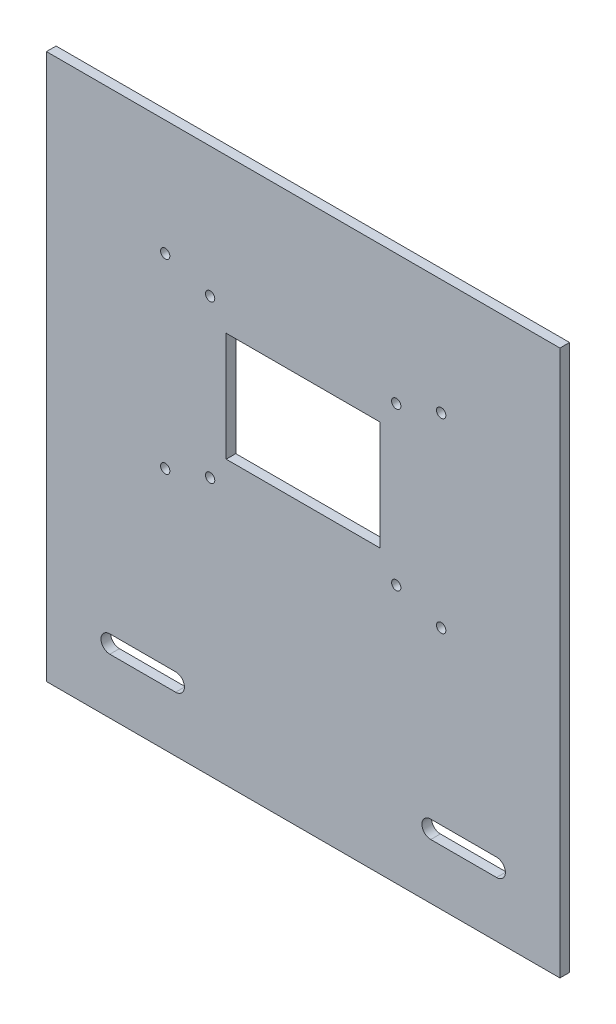
ISO-10303-21;
HEADER;
FILE_DESCRIPTION(('STEP AP214'),'2;1');
FILE_NAME('part.step','',(''),(''),'','','');
FILE_SCHEMA(('AUTOMOTIVE_DESIGN { 1 0 10303 214 1 1 1 1 }'));
ENDSEC;
DATA;
#1=APPLICATION_CONTEXT('core data for automotive mechanical design processes');
#2=APPLICATION_PROTOCOL_DEFINITION('international standard','automotive_design',2000,#1);
#3=PRODUCT_CONTEXT('',#1,'mechanical');
#4=PRODUCT('Part','Part','',(#3));
#5=PRODUCT_RELATED_PRODUCT_CATEGORY('part','',(#4));
#6=PRODUCT_DEFINITION_FORMATION('','',#4);
#7=PRODUCT_DEFINITION_CONTEXT('part definition',#1,'design');
#8=PRODUCT_DEFINITION('design','',#6,#7);
#9=PRODUCT_DEFINITION_SHAPE('','',#8);
#10=(LENGTH_UNIT() NAMED_UNIT(*) SI_UNIT(.MILLI.,.METRE.));
#11=(NAMED_UNIT(*) PLANE_ANGLE_UNIT() SI_UNIT($,.RADIAN.));
#12=(NAMED_UNIT(*) SI_UNIT($,.STERADIAN.) SOLID_ANGLE_UNIT());
#13=UNCERTAINTY_MEASURE_WITH_UNIT(LENGTH_MEASURE(1.E-05),#10,'distance_accuracy_value','');
#14=(GEOMETRIC_REPRESENTATION_CONTEXT(3) GLOBAL_UNCERTAINTY_ASSIGNED_CONTEXT((#13)) GLOBAL_UNIT_ASSIGNED_CONTEXT((#10,
#11,#12)) REPRESENTATION_CONTEXT('',''));
#15=CARTESIAN_POINT('',(0.,0.,0.));
#16=DIRECTION('',(0.,0.,1.));
#17=DIRECTION('',(1.,0.,0.));
#18=AXIS2_PLACEMENT_3D('',#15,#16,#17);
#19=CARTESIAN_POINT('',(0.,0.,3.));
#20=DIRECTION('',(0.,0.,1.));
#21=DIRECTION('',(1.,0.,0.));
#22=AXIS2_PLACEMENT_3D('',#19,#20,#21);
#23=PLANE('',#22);
#24=CARTESIAN_POINT('',(123.,76.,3.));
#25=DIRECTION('',(0.,0.,1.));
#26=DIRECTION('',(1.,0.,0.));
#27=AXIS2_PLACEMENT_3D('',#24,#25,#26);
#28=CIRCLE('',#27,1.45000000000001);
#29=CARTESIAN_POINT('',(124.45,76.,3.));
#30=VERTEX_POINT('',#29);
#31=EDGE_CURVE('E225',#30,#30,#28,.T.);
#32=ORIENTED_EDGE('',*,*,#31,.F.);
#33=EDGE_LOOP('',(#32));
#34=FACE_BOUND('',#33,.T.);
#35=CARTESIAN_POINT('',(37.,76.,3.));
#36=DIRECTION('',(0.,0.,1.));
#37=DIRECTION('',(1.,0.,0.));
#38=AXIS2_PLACEMENT_3D('',#35,#36,#37);
#39=CIRCLE('',#38,1.45);
#40=CARTESIAN_POINT('',(38.45,76.,3.));
#41=VERTEX_POINT('',#40);
#42=EDGE_CURVE('E237',#41,#41,#39,.T.);
#43=ORIENTED_EDGE('',*,*,#42,.F.);
#44=EDGE_LOOP('',(#43));
#45=FACE_BOUND('',#44,.T.);
#46=CARTESIAN_POINT('',(109.,80.5,3.));
#47=DIRECTION('',(0.,0.,1.));
#48=DIRECTION('',(1.,0.,0.));
#49=AXIS2_PLACEMENT_3D('',#46,#47,#48);
#50=CIRCLE('',#49,1.44999999999999);
#51=CARTESIAN_POINT('',(110.45,80.5,3.));
#52=VERTEX_POINT('',#51);
#53=EDGE_CURVE('E249',#52,#52,#50,.T.);
#54=ORIENTED_EDGE('',*,*,#53,.F.);
#55=EDGE_LOOP('',(#54));
#56=FACE_BOUND('',#55,.T.);
#57=CARTESIAN_POINT('',(51.,80.5,3.));
#58=DIRECTION('',(0.,0.,1.));
#59=DIRECTION('',(1.,0.,0.));
#60=AXIS2_PLACEMENT_3D('',#57,#58,#59);
#61=CIRCLE('',#60,1.45);
#62=CARTESIAN_POINT('',(52.45,80.5,3.));
#63=VERTEX_POINT('',#62);
#64=EDGE_CURVE('E261',#63,#63,#61,.T.);
#65=ORIENTED_EDGE('',*,*,#64,.F.);
#66=EDGE_LOOP('',(#65));
#67=FACE_BOUND('',#66,.T.);
#68=DIRECTION('',(0.,-1.,0.));
#69=VECTOR('',#68,1.);
#70=CARTESIAN_POINT('',(0.,170.,3.));
#71=LINE('',#70,#69);
#72=CARTESIAN_POINT('',(0.,170.,3.));
#73=VERTEX_POINT('',#72);
#74=CARTESIAN_POINT('',(0.,0.,3.));
#75=VERTEX_POINT('',#74);
#76=EDGE_CURVE('E298',#73,#75,#71,.T.);
#77=ORIENTED_EDGE('',*,*,#76,.T.);
#78=DIRECTION('',(1.,0.,0.));
#79=VECTOR('',#78,1.);
#80=CARTESIAN_POINT('',(0.,0.,3.));
#81=LINE('',#80,#79);
#82=CARTESIAN_POINT('',(160.,0.,3.));
#83=VERTEX_POINT('',#82);
#84=EDGE_CURVE('E301',#75,#83,#81,.T.);
#85=ORIENTED_EDGE('',*,*,#84,.T.);
#86=DIRECTION('',(0.,1.,0.));
#87=VECTOR('',#86,1.);
#88=CARTESIAN_POINT('',(160.,0.,3.));
#89=LINE('',#88,#87);
#90=CARTESIAN_POINT('',(160.,170.,3.));
#91=VERTEX_POINT('',#90);
#92=EDGE_CURVE('E304',#83,#91,#89,.T.);
#93=ORIENTED_EDGE('',*,*,#92,.T.);
#94=DIRECTION('',(-1.,0.,0.));
#95=VECTOR('',#94,1.);
#96=CARTESIAN_POINT('',(160.,170.,3.));
#97=LINE('',#96,#95);
#98=EDGE_CURVE('E306',#91,#73,#97,.T.);
#99=ORIENTED_EDGE('',*,*,#98,.T.);
#100=EDGE_LOOP('',(#77,#85,#93,#99));
#101=FACE_BOUND('',#100,.T.);
#102=DIRECTION('',(1.,0.,0.));
#103=VECTOR('',#102,1.);
#104=CARTESIAN_POINT('',(56.,88.,3.));
#105=LINE('',#104,#103);
#106=CARTESIAN_POINT('',(56.,88.,3.));
#107=VERTEX_POINT('',#106);
#108=CARTESIAN_POINT('',(104.,88.,3.));
#109=VERTEX_POINT('',#108);
#110=EDGE_CURVE('E269',#107,#109,#105,.T.);
#111=ORIENTED_EDGE('',*,*,#110,.F.);
#112=DIRECTION('',(0.,-1.,0.));
#113=VECTOR('',#112,1.);
#114=CARTESIAN_POINT('',(56.,122.,3.));
#115=LINE('',#114,#113);
#116=CARTESIAN_POINT('',(56.,122.,3.));
#117=VERTEX_POINT('',#116);
#118=EDGE_CURVE('E267',#117,#107,#115,.T.);
#119=ORIENTED_EDGE('',*,*,#118,.F.);
#120=DIRECTION('',(-1.,0.,0.));
#121=VECTOR('',#120,1.);
#122=CARTESIAN_POINT('',(104.,122.,3.));
#123=LINE('',#122,#121);
#124=CARTESIAN_POINT('',(104.,122.,3.));
#125=VERTEX_POINT('',#124);
#126=EDGE_CURVE('E275',#125,#117,#123,.T.);
#127=ORIENTED_EDGE('',*,*,#126,.F.);
#128=DIRECTION('',(0.,1.,0.));
#129=VECTOR('',#128,1.);
#130=CARTESIAN_POINT('',(104.,88.,3.));
#131=LINE('',#130,#129);
#132=EDGE_CURVE('E272',#109,#125,#131,.T.);
#133=ORIENTED_EDGE('',*,*,#132,.F.);
#134=EDGE_LOOP('',(#111,#119,#127,#133));
#135=FACE_BOUND('',#134,.T.);
#136=CARTESIAN_POINT('',(51.,129.5,3.));
#137=DIRECTION('',(0.,0.,1.));
#138=DIRECTION('',(1.,0.,0.));
#139=AXIS2_PLACEMENT_3D('',#136,#137,#138);
#140=CIRCLE('',#139,1.45);
#141=CARTESIAN_POINT('',(52.45,129.5,3.));
#142=VERTEX_POINT('',#141);
#143=EDGE_CURVE('E255',#142,#142,#140,.T.);
#144=ORIENTED_EDGE('',*,*,#143,.F.);
#145=EDGE_LOOP('',(#144));
#146=FACE_BOUND('',#145,.T.);
#147=CARTESIAN_POINT('',(109.,129.5,3.));
#148=DIRECTION('',(0.,0.,1.));
#149=DIRECTION('',(1.,0.,0.));
#150=AXIS2_PLACEMENT_3D('',#147,#148,#149);
#151=CIRCLE('',#150,1.44999999999999);
#152=CARTESIAN_POINT('',(110.45,129.5,3.));
#153=VERTEX_POINT('',#152);
#154=EDGE_CURVE('E243',#153,#153,#151,.T.);
#155=ORIENTED_EDGE('',*,*,#154,.F.);
#156=EDGE_LOOP('',(#155));
#157=FACE_BOUND('',#156,.T.);
#158=CARTESIAN_POINT('',(37.,134.,3.));
#159=DIRECTION('',(0.,0.,1.));
#160=DIRECTION('',(1.,0.,0.));
#161=AXIS2_PLACEMENT_3D('',#158,#159,#160);
#162=CIRCLE('',#161,1.45);
#163=CARTESIAN_POINT('',(38.45,134.,3.));
#164=VERTEX_POINT('',#163);
#165=EDGE_CURVE('E231',#164,#164,#162,.T.);
#166=ORIENTED_EDGE('',*,*,#165,.F.);
#167=EDGE_LOOP('',(#166));
#168=FACE_BOUND('',#167,.T.);
#169=CARTESIAN_POINT('',(123.,134.,3.));
#170=DIRECTION('',(0.,0.,1.));
#171=DIRECTION('',(1.,0.,0.));
#172=AXIS2_PLACEMENT_3D('',#169,#170,#171);
#173=CIRCLE('',#172,1.45000000000001);
#174=CARTESIAN_POINT('',(124.45,134.,3.));
#175=VERTEX_POINT('',#174);
#176=EDGE_CURVE('E219',#175,#175,#173,.T.);
#177=ORIENTED_EDGE('',*,*,#176,.F.);
#178=EDGE_LOOP('',(#177));
#179=FACE_BOUND('',#178,.T.);
#180=DIRECTION('',(1.,0.,0.));
#181=VECTOR('',#180,1.);
#182=CARTESIAN_POINT('',(40.25,17.25,3.));
#183=LINE('',#182,#181);
#184=CARTESIAN_POINT('',(19.75,17.25,3.));
#185=VERTEX_POINT('',#184);
#186=CARTESIAN_POINT('',(40.25,17.25,3.));
#187=VERTEX_POINT('',#186);
#188=EDGE_CURVE('E190',#185,#187,#183,.T.);
#189=ORIENTED_EDGE('',*,*,#188,.F.);
#190=CARTESIAN_POINT('',(19.75,20.,3.));
#191=DIRECTION('',(0.,0.,1.));
#192=DIRECTION('',(-1.,0.,0.));
#193=AXIS2_PLACEMENT_3D('',#190,#191,#192);
#194=CIRCLE('',#193,2.75);
#195=CARTESIAN_POINT('',(19.75,22.75,3.));
#196=VERTEX_POINT('',#195);
#197=EDGE_CURVE('E188',#196,#185,#194,.T.);
#198=ORIENTED_EDGE('',*,*,#197,.F.);
#199=DIRECTION('',(-1.,0.,0.));
#200=VECTOR('',#199,1.);
#201=CARTESIAN_POINT('',(19.75,22.75,3.));
#202=LINE('',#201,#200);
#203=CARTESIAN_POINT('',(40.25,22.75,3.));
#204=VERTEX_POINT('',#203);
#205=EDGE_CURVE('E196',#204,#196,#202,.T.);
#206=ORIENTED_EDGE('',*,*,#205,.F.);
#207=CARTESIAN_POINT('',(40.25,20.,3.));
#208=DIRECTION('',(0.,0.,1.));
#209=DIRECTION('',(-1.,0.,0.));
#210=AXIS2_PLACEMENT_3D('',#207,#208,#209);
#211=CIRCLE('',#210,2.75);
#212=EDGE_CURVE('E193',#187,#204,#211,.T.);
#213=ORIENTED_EDGE('',*,*,#212,.F.);
#214=EDGE_LOOP('',(#189,#198,#206,#213));
#215=FACE_BOUND('',#214,.T.);
#216=DIRECTION('',(1.,0.,0.));
#217=VECTOR('',#216,1.);
#218=CARTESIAN_POINT('',(140.25,17.25,3.));
#219=LINE('',#218,#217);
#220=CARTESIAN_POINT('',(119.75,17.25,3.));
#221=VERTEX_POINT('',#220);
#222=CARTESIAN_POINT('',(140.25,17.25,3.));
#223=VERTEX_POINT('',#222);
#224=EDGE_CURVE('E160',#221,#223,#219,.T.);
#225=ORIENTED_EDGE('',*,*,#224,.F.);
#226=CARTESIAN_POINT('',(119.75,20.,3.));
#227=DIRECTION('',(0.,0.,1.));
#228=DIRECTION('',(-1.,0.,0.));
#229=AXIS2_PLACEMENT_3D('',#226,#227,#228);
#230=CIRCLE('',#229,2.75);
#231=CARTESIAN_POINT('',(119.75,22.75,3.));
#232=VERTEX_POINT('',#231);
#233=EDGE_CURVE('E152',#232,#221,#230,.T.);
#234=ORIENTED_EDGE('',*,*,#233,.F.);
#235=DIRECTION('',(-1.,0.,0.));
#236=VECTOR('',#235,1.);
#237=CARTESIAN_POINT('',(119.75,22.75,3.));
#238=LINE('',#237,#236);
#239=CARTESIAN_POINT('',(140.25,22.75,3.));
#240=VERTEX_POINT('',#239);
#241=EDGE_CURVE('E174',#240,#232,#238,.T.);
#242=ORIENTED_EDGE('',*,*,#241,.F.);
#243=CARTESIAN_POINT('',(140.25,20.,3.));
#244=DIRECTION('',(0.,0.,1.));
#245=DIRECTION('',(-1.,0.,0.));
#246=AXIS2_PLACEMENT_3D('',#243,#244,#245);
#247=CIRCLE('',#246,2.75);
#248=EDGE_CURVE('E172',#223,#240,#247,.T.);
#249=ORIENTED_EDGE('',*,*,#248,.F.);
#250=EDGE_LOOP('',(#225,#234,#242,#249));
#251=FACE_BOUND('',#250,.T.);
#252=ADVANCED_FACE('F39',(#34,#45,#56,#67,#101,#135,#146,#157,#168,#179,#215,#251),#23,.T.);
#253=CARTESIAN_POINT('',(0.,0.,0.));
#254=DIRECTION('',(0.,0.,1.));
#255=DIRECTION('',(1.,0.,0.));
#256=AXIS2_PLACEMENT_3D('',#253,#254,#255);
#257=PLANE('',#256);
#258=CARTESIAN_POINT('',(19.75,20.,0.));
#259=DIRECTION('',(0.,0.,1.));
#260=DIRECTION('',(-1.,0.,0.));
#261=AXIS2_PLACEMENT_3D('',#258,#259,#260);
#262=CIRCLE('',#261,2.75);
#263=CARTESIAN_POINT('',(19.75,22.75,0.));
#264=VERTEX_POINT('',#263);
#265=CARTESIAN_POINT('',(19.75,17.25,0.));
#266=VERTEX_POINT('',#265);
#267=EDGE_CURVE('E168',#264,#266,#262,.T.);
#268=ORIENTED_EDGE('',*,*,#267,.T.);
#269=DIRECTION('',(1.,0.,0.));
#270=VECTOR('',#269,1.);
#271=CARTESIAN_POINT('',(40.25,17.25,0.));
#272=LINE('',#271,#270);
#273=CARTESIAN_POINT('',(40.25,17.25,0.));
#274=VERTEX_POINT('',#273);
#275=EDGE_CURVE('E201',#266,#274,#272,.T.);
#276=ORIENTED_EDGE('',*,*,#275,.T.);
#277=CARTESIAN_POINT('',(40.25,20.,0.));
#278=DIRECTION('',(0.,0.,1.));
#279=DIRECTION('',(-1.,0.,0.));
#280=AXIS2_PLACEMENT_3D('',#277,#278,#279);
#281=CIRCLE('',#280,2.75);
#282=CARTESIAN_POINT('',(40.25,22.75,0.));
#283=VERTEX_POINT('',#282);
#284=EDGE_CURVE('E204',#274,#283,#281,.T.);
#285=ORIENTED_EDGE('',*,*,#284,.T.);
#286=DIRECTION('',(-1.,0.,0.));
#287=VECTOR('',#286,1.);
#288=CARTESIAN_POINT('',(19.75,22.75,0.));
#289=LINE('',#288,#287);
#290=EDGE_CURVE('E191',#283,#264,#289,.T.);
#291=ORIENTED_EDGE('',*,*,#290,.T.);
#292=EDGE_LOOP('',(#268,#276,#285,#291));
#293=FACE_BOUND('',#292,.T.);
#294=DIRECTION('',(0.,-1.,0.));
#295=VECTOR('',#294,1.);
#296=CARTESIAN_POINT('',(0.,170.,0.));
#297=LINE('',#296,#295);
#298=CARTESIAN_POINT('',(0.,170.,0.));
#299=VERTEX_POINT('',#298);
#300=CARTESIAN_POINT('',(0.,0.,0.));
#301=VERTEX_POINT('',#300);
#302=EDGE_CURVE('E297',#299,#301,#297,.T.);
#303=ORIENTED_EDGE('',*,*,#302,.F.);
#304=DIRECTION('',(-1.,0.,0.));
#305=VECTOR('',#304,1.);
#306=CARTESIAN_POINT('',(160.,170.,0.));
#307=LINE('',#306,#305);
#308=CARTESIAN_POINT('',(160.,170.,0.));
#309=VERTEX_POINT('',#308);
#310=EDGE_CURVE('E302',#309,#299,#307,.T.);
#311=ORIENTED_EDGE('',*,*,#310,.F.);
#312=DIRECTION('',(0.,1.,0.));
#313=VECTOR('',#312,1.);
#314=CARTESIAN_POINT('',(160.,0.,0.));
#315=LINE('',#314,#313);
#316=CARTESIAN_POINT('',(160.,0.,0.));
#317=VERTEX_POINT('',#316);
#318=EDGE_CURVE('E313',#317,#309,#315,.T.);
#319=ORIENTED_EDGE('',*,*,#318,.F.);
#320=DIRECTION('',(1.,0.,0.));
#321=VECTOR('',#320,1.);
#322=CARTESIAN_POINT('',(0.,0.,0.));
#323=LINE('',#322,#321);
#324=EDGE_CURVE('E311',#301,#317,#323,.T.);
#325=ORIENTED_EDGE('',*,*,#324,.F.);
#326=EDGE_LOOP('',(#303,#311,#319,#325));
#327=FACE_BOUND('',#326,.T.);
#328=DIRECTION('',(0.,-1.,0.));
#329=VECTOR('',#328,1.);
#330=CARTESIAN_POINT('',(56.,122.,0.));
#331=LINE('',#330,#329);
#332=CARTESIAN_POINT('',(56.,122.,0.));
#333=VERTEX_POINT('',#332);
#334=CARTESIAN_POINT('',(56.,88.,0.));
#335=VERTEX_POINT('',#334);
#336=EDGE_CURVE('E264',#333,#335,#331,.T.);
#337=ORIENTED_EDGE('',*,*,#336,.T.);
#338=DIRECTION('',(1.,0.,0.));
#339=VECTOR('',#338,1.);
#340=CARTESIAN_POINT('',(56.,88.,0.));
#341=LINE('',#340,#339);
#342=CARTESIAN_POINT('',(104.,88.,0.));
#343=VERTEX_POINT('',#342);
#344=EDGE_CURVE('E280',#335,#343,#341,.T.);
#345=ORIENTED_EDGE('',*,*,#344,.T.);
#346=DIRECTION('',(0.,1.,0.));
#347=VECTOR('',#346,1.);
#348=CARTESIAN_POINT('',(104.,88.,0.));
#349=LINE('',#348,#347);
#350=CARTESIAN_POINT('',(104.,122.,0.));
#351=VERTEX_POINT('',#350);
#352=EDGE_CURVE('E283',#343,#351,#349,.T.);
#353=ORIENTED_EDGE('',*,*,#352,.T.);
#354=DIRECTION('',(-1.,0.,0.));
#355=VECTOR('',#354,1.);
#356=CARTESIAN_POINT('',(104.,122.,0.));
#357=LINE('',#356,#355);
#358=EDGE_CURVE('E270',#351,#333,#357,.T.);
#359=ORIENTED_EDGE('',*,*,#358,.T.);
#360=EDGE_LOOP('',(#337,#345,#353,#359));
#361=FACE_BOUND('',#360,.T.);
#362=CARTESIAN_POINT('',(51.,80.5,0.));
#363=DIRECTION('',(0.,0.,1.));
#364=DIRECTION('',(1.,0.,0.));
#365=AXIS2_PLACEMENT_3D('',#362,#363,#364);
#366=CIRCLE('',#365,1.45);
#367=CARTESIAN_POINT('',(52.45,80.5,0.));
#368=VERTEX_POINT('',#367);
#369=EDGE_CURVE('E258',#368,#368,#366,.T.);
#370=ORIENTED_EDGE('',*,*,#369,.T.);
#371=EDGE_LOOP('',(#370));
#372=FACE_BOUND('',#371,.T.);
#373=CARTESIAN_POINT('',(51.,129.5,0.));
#374=DIRECTION('',(0.,0.,1.));
#375=DIRECTION('',(1.,0.,0.));
#376=AXIS2_PLACEMENT_3D('',#373,#374,#375);
#377=CIRCLE('',#376,1.45);
#378=CARTESIAN_POINT('',(52.45,129.5,0.));
#379=VERTEX_POINT('',#378);
#380=EDGE_CURVE('E252',#379,#379,#377,.T.);
#381=ORIENTED_EDGE('',*,*,#380,.T.);
#382=EDGE_LOOP('',(#381));
#383=FACE_BOUND('',#382,.T.);
#384=CARTESIAN_POINT('',(109.,80.5,0.));
#385=DIRECTION('',(0.,0.,1.));
#386=DIRECTION('',(1.,0.,0.));
#387=AXIS2_PLACEMENT_3D('',#384,#385,#386);
#388=CIRCLE('',#387,1.44999999999999);
#389=CARTESIAN_POINT('',(110.45,80.5,0.));
#390=VERTEX_POINT('',#389);
#391=EDGE_CURVE('E246',#390,#390,#388,.T.);
#392=ORIENTED_EDGE('',*,*,#391,.T.);
#393=EDGE_LOOP('',(#392));
#394=FACE_BOUND('',#393,.T.);
#395=CARTESIAN_POINT('',(109.,129.5,0.));
#396=DIRECTION('',(0.,0.,1.));
#397=DIRECTION('',(1.,0.,0.));
#398=AXIS2_PLACEMENT_3D('',#395,#396,#397);
#399=CIRCLE('',#398,1.44999999999999);
#400=CARTESIAN_POINT('',(110.45,129.5,0.));
#401=VERTEX_POINT('',#400);
#402=EDGE_CURVE('E240',#401,#401,#399,.T.);
#403=ORIENTED_EDGE('',*,*,#402,.T.);
#404=EDGE_LOOP('',(#403));
#405=FACE_BOUND('',#404,.T.);
#406=CARTESIAN_POINT('',(37.,76.,0.));
#407=DIRECTION('',(0.,0.,1.));
#408=DIRECTION('',(1.,0.,0.));
#409=AXIS2_PLACEMENT_3D('',#406,#407,#408);
#410=CIRCLE('',#409,1.45);
#411=CARTESIAN_POINT('',(38.45,76.,0.));
#412=VERTEX_POINT('',#411);
#413=EDGE_CURVE('E234',#412,#412,#410,.T.);
#414=ORIENTED_EDGE('',*,*,#413,.T.);
#415=EDGE_LOOP('',(#414));
#416=FACE_BOUND('',#415,.T.);
#417=CARTESIAN_POINT('',(37.,134.,0.));
#418=DIRECTION('',(0.,0.,1.));
#419=DIRECTION('',(1.,0.,0.));
#420=AXIS2_PLACEMENT_3D('',#417,#418,#419);
#421=CIRCLE('',#420,1.45);
#422=CARTESIAN_POINT('',(38.45,134.,0.));
#423=VERTEX_POINT('',#422);
#424=EDGE_CURVE('E228',#423,#423,#421,.T.);
#425=ORIENTED_EDGE('',*,*,#424,.T.);
#426=EDGE_LOOP('',(#425));
#427=FACE_BOUND('',#426,.T.);
#428=CARTESIAN_POINT('',(123.,76.,0.));
#429=DIRECTION('',(0.,0.,1.));
#430=DIRECTION('',(1.,0.,0.));
#431=AXIS2_PLACEMENT_3D('',#428,#429,#430);
#432=CIRCLE('',#431,1.45000000000001);
#433=CARTESIAN_POINT('',(124.45,76.,0.));
#434=VERTEX_POINT('',#433);
#435=EDGE_CURVE('E222',#434,#434,#432,.T.);
#436=ORIENTED_EDGE('',*,*,#435,.T.);
#437=EDGE_LOOP('',(#436));
#438=FACE_BOUND('',#437,.T.);
#439=CARTESIAN_POINT('',(123.,134.,0.));
#440=DIRECTION('',(0.,0.,1.));
#441=DIRECTION('',(1.,0.,0.));
#442=AXIS2_PLACEMENT_3D('',#439,#440,#441);
#443=CIRCLE('',#442,1.45000000000001);
#444=CARTESIAN_POINT('',(124.45,134.,0.));
#445=VERTEX_POINT('',#444);
#446=EDGE_CURVE('E218',#445,#445,#443,.T.);
#447=ORIENTED_EDGE('',*,*,#446,.T.);
#448=EDGE_LOOP('',(#447));
#449=FACE_BOUND('',#448,.T.);
#450=CARTESIAN_POINT('',(119.75,20.,0.));
#451=DIRECTION('',(0.,0.,1.));
#452=DIRECTION('',(-1.,0.,0.));
#453=AXIS2_PLACEMENT_3D('',#450,#451,#452);
#454=CIRCLE('',#453,2.75);
#455=CARTESIAN_POINT('',(119.75,22.75,0.));
#456=VERTEX_POINT('',#455);
#457=CARTESIAN_POINT('',(119.75,17.25,0.));
#458=VERTEX_POINT('',#457);
#459=EDGE_CURVE('E62',#456,#458,#454,.T.);
#460=ORIENTED_EDGE('',*,*,#459,.T.);
#461=DIRECTION('',(1.,0.,0.));
#462=VECTOR('',#461,1.);
#463=CARTESIAN_POINT('',(140.25,17.25,0.));
#464=LINE('',#463,#462);
#465=CARTESIAN_POINT('',(140.25,17.25,0.));
#466=VERTEX_POINT('',#465);
#467=EDGE_CURVE('E167',#458,#466,#464,.T.);
#468=ORIENTED_EDGE('',*,*,#467,.T.);
#469=CARTESIAN_POINT('',(140.25,20.,0.));
#470=DIRECTION('',(0.,0.,1.));
#471=DIRECTION('',(-1.,0.,0.));
#472=AXIS2_PLACEMENT_3D('',#469,#470,#471);
#473=CIRCLE('',#472,2.75);
#474=CARTESIAN_POINT('',(140.25,22.75,0.));
#475=VERTEX_POINT('',#474);
#476=EDGE_CURVE('E180',#466,#475,#473,.T.);
#477=ORIENTED_EDGE('',*,*,#476,.T.);
#478=DIRECTION('',(-1.,0.,0.));
#479=VECTOR('',#478,1.);
#480=CARTESIAN_POINT('',(119.75,22.75,0.));
#481=LINE('',#480,#479);
#482=EDGE_CURVE('E161',#475,#456,#481,.T.);
#483=ORIENTED_EDGE('',*,*,#482,.T.);
#484=EDGE_LOOP('',(#460,#468,#477,#483));
#485=FACE_BOUND('',#484,.T.);
#486=ADVANCED_FACE('F331',(#293,#327,#361,#372,#383,#394,#405,#416,#427,#438,#449,#485),#257,.F.);
#487=CARTESIAN_POINT('',(0.,170.,3.));
#488=DIRECTION('',(1.,0.,0.));
#489=DIRECTION('',(0.,0.,-1.));
#490=AXIS2_PLACEMENT_3D('',#487,#488,#489);
#491=PLANE('',#490);
#492=ORIENTED_EDGE('',*,*,#302,.T.);
#493=DIRECTION('',(0.,0.,-1.));
#494=VECTOR('',#493,1.);
#495=CARTESIAN_POINT('',(0.,0.,3.));
#496=LINE('',#495,#494);
#497=EDGE_CURVE('E11',#75,#301,#496,.T.);
#498=ORIENTED_EDGE('',*,*,#497,.F.);
#499=ORIENTED_EDGE('',*,*,#76,.F.);
#500=DIRECTION('',(0.,0.,-1.));
#501=VECTOR('',#500,1.);
#502=CARTESIAN_POINT('',(0.,170.,3.));
#503=LINE('',#502,#501);
#504=EDGE_CURVE('E308',#73,#299,#503,.T.);
#505=ORIENTED_EDGE('',*,*,#504,.T.);
#506=EDGE_LOOP('',(#492,#498,#499,#505));
#507=FACE_BOUND('',#506,.T.);
#508=ADVANCED_FACE('F41',(#507),#491,.F.);
#509=CARTESIAN_POINT('',(0.,0.,3.));
#510=DIRECTION('',(0.,1.,0.));
#511=DIRECTION('',(0.,0.,1.));
#512=AXIS2_PLACEMENT_3D('',#509,#510,#511);
#513=PLANE('',#512);
#514=ORIENTED_EDGE('',*,*,#324,.T.);
#515=DIRECTION('',(0.,0.,-1.));
#516=VECTOR('',#515,1.);
#517=CARTESIAN_POINT('',(160.,0.,3.));
#518=LINE('',#517,#516);
#519=EDGE_CURVE('E47',#83,#317,#518,.T.);
#520=ORIENTED_EDGE('',*,*,#519,.F.);
#521=ORIENTED_EDGE('',*,*,#84,.F.);
#522=ORIENTED_EDGE('',*,*,#497,.T.);
#523=EDGE_LOOP('',(#514,#520,#521,#522));
#524=FACE_BOUND('',#523,.T.);
#525=ADVANCED_FACE('F342',(#524),#513,.F.);
#526=CARTESIAN_POINT('',(160.,0.,3.));
#527=DIRECTION('',(-1.,0.,0.));
#528=DIRECTION('',(0.,0.,1.));
#529=AXIS2_PLACEMENT_3D('',#526,#527,#528);
#530=PLANE('',#529);
#531=ORIENTED_EDGE('',*,*,#318,.T.);
#532=DIRECTION('',(0.,0.,-1.));
#533=VECTOR('',#532,1.);
#534=CARTESIAN_POINT('',(160.,170.,3.));
#535=LINE('',#534,#533);
#536=EDGE_CURVE('E318',#91,#309,#535,.T.);
#537=ORIENTED_EDGE('',*,*,#536,.F.);
#538=ORIENTED_EDGE('',*,*,#92,.F.);
#539=ORIENTED_EDGE('',*,*,#519,.T.);
#540=EDGE_LOOP('',(#531,#537,#538,#539));
#541=FACE_BOUND('',#540,.T.);
#542=ADVANCED_FACE('F325',(#541),#530,.F.);
#543=CARTESIAN_POINT('',(160.,170.,3.));
#544=DIRECTION('',(0.,-1.,0.));
#545=DIRECTION('',(0.,0.,-1.));
#546=AXIS2_PLACEMENT_3D('',#543,#544,#545);
#547=PLANE('',#546);
#548=ORIENTED_EDGE('',*,*,#310,.T.);
#549=ORIENTED_EDGE('',*,*,#504,.F.);
#550=ORIENTED_EDGE('',*,*,#98,.F.);
#551=ORIENTED_EDGE('',*,*,#536,.T.);
#552=EDGE_LOOP('',(#548,#549,#550,#551));
#553=FACE_BOUND('',#552,.T.);
#554=ADVANCED_FACE('F335',(#553),#547,.F.);
#555=CARTESIAN_POINT('',(56.,122.,3.));
#556=DIRECTION('',(1.,0.,0.));
#557=DIRECTION('',(0.,0.,-1.));
#558=AXIS2_PLACEMENT_3D('',#555,#556,#557);
#559=PLANE('',#558);
#560=ORIENTED_EDGE('',*,*,#336,.F.);
#561=DIRECTION('',(0.,0.,-1.));
#562=VECTOR('',#561,1.);
#563=CARTESIAN_POINT('',(56.,122.,3.));
#564=LINE('',#563,#562);
#565=EDGE_CURVE('E277',#117,#333,#564,.T.);
#566=ORIENTED_EDGE('',*,*,#565,.F.);
#567=ORIENTED_EDGE('',*,*,#118,.T.);
#568=DIRECTION('',(0.,0.,-1.));
#569=VECTOR('',#568,1.);
#570=CARTESIAN_POINT('',(56.,88.,3.));
#571=LINE('',#570,#569);
#572=EDGE_CURVE('E294',#107,#335,#571,.T.);
#573=ORIENTED_EDGE('',*,*,#572,.T.);
#574=EDGE_LOOP('',(#560,#566,#567,#573));
#575=FACE_BOUND('',#574,.T.);
#576=ADVANCED_FACE('F360',(#575),#559,.T.);
#577=CARTESIAN_POINT('',(56.,88.,3.));
#578=DIRECTION('',(0.,1.,0.));
#579=DIRECTION('',(0.,0.,1.));
#580=AXIS2_PLACEMENT_3D('',#577,#578,#579);
#581=PLANE('',#580);
#582=ORIENTED_EDGE('',*,*,#344,.F.);
#583=ORIENTED_EDGE('',*,*,#572,.F.);
#584=ORIENTED_EDGE('',*,*,#110,.T.);
#585=DIRECTION('',(0.,0.,-1.));
#586=VECTOR('',#585,1.);
#587=CARTESIAN_POINT('',(104.,88.,3.));
#588=LINE('',#587,#586);
#589=EDGE_CURVE('E292',#109,#343,#588,.T.);
#590=ORIENTED_EDGE('',*,*,#589,.T.);
#591=EDGE_LOOP('',(#582,#583,#584,#590));
#592=FACE_BOUND('',#591,.T.);
#593=ADVANCED_FACE('F367',(#592),#581,.T.);
#594=CARTESIAN_POINT('',(104.,88.,3.));
#595=DIRECTION('',(-1.,0.,0.));
#596=DIRECTION('',(0.,0.,1.));
#597=AXIS2_PLACEMENT_3D('',#594,#595,#596);
#598=PLANE('',#597);
#599=ORIENTED_EDGE('',*,*,#352,.F.);
#600=ORIENTED_EDGE('',*,*,#589,.F.);
#601=ORIENTED_EDGE('',*,*,#132,.T.);
#602=DIRECTION('',(0.,0.,-1.));
#603=VECTOR('',#602,1.);
#604=CARTESIAN_POINT('',(104.,122.,3.));
#605=LINE('',#604,#603);
#606=EDGE_CURVE('E290',#125,#351,#605,.T.);
#607=ORIENTED_EDGE('',*,*,#606,.T.);
#608=EDGE_LOOP('',(#599,#600,#601,#607));
#609=FACE_BOUND('',#608,.T.);
#610=ADVANCED_FACE('F372',(#609),#598,.T.);
#611=CARTESIAN_POINT('',(104.,122.,3.));
#612=DIRECTION('',(0.,-1.,0.));
#613=DIRECTION('',(0.,0.,-1.));
#614=AXIS2_PLACEMENT_3D('',#611,#612,#613);
#615=PLANE('',#614);
#616=ORIENTED_EDGE('',*,*,#358,.F.);
#617=ORIENTED_EDGE('',*,*,#606,.F.);
#618=ORIENTED_EDGE('',*,*,#126,.T.);
#619=ORIENTED_EDGE('',*,*,#565,.T.);
#620=EDGE_LOOP('',(#616,#617,#618,#619));
#621=FACE_BOUND('',#620,.T.);
#622=ADVANCED_FACE('F379',(#621),#615,.T.);
#623=CARTESIAN_POINT('',(51.,80.5,3.));
#624=DIRECTION('',(0.,0.,-1.));
#625=DIRECTION('',(-1.,0.,0.));
#626=AXIS2_PLACEMENT_3D('',#623,#624,#625);
#627=CYLINDRICAL_SURFACE('',#626,1.45);
#628=ORIENTED_EDGE('',*,*,#64,.T.);
#629=EDGE_LOOP('',(#628));
#630=FACE_BOUND('',#629,.T.);
#631=ORIENTED_EDGE('',*,*,#369,.F.);
#632=EDGE_LOOP('',(#631));
#633=FACE_BOUND('',#632,.T.);
#634=ADVANCED_FACE('F454',(#630,#633),#627,.F.);
#635=CARTESIAN_POINT('',(51.,129.5,3.));
#636=DIRECTION('',(0.,0.,-1.));
#637=DIRECTION('',(-1.,0.,0.));
#638=AXIS2_PLACEMENT_3D('',#635,#636,#637);
#639=CYLINDRICAL_SURFACE('',#638,1.45);
#640=ORIENTED_EDGE('',*,*,#143,.T.);
#641=EDGE_LOOP('',(#640));
#642=FACE_BOUND('',#641,.T.);
#643=ORIENTED_EDGE('',*,*,#380,.F.);
#644=EDGE_LOOP('',(#643));
#645=FACE_BOUND('',#644,.T.);
#646=ADVANCED_FACE('F450',(#642,#645),#639,.F.);
#647=CARTESIAN_POINT('',(109.,80.5,3.));
#648=DIRECTION('',(0.,0.,-1.));
#649=DIRECTION('',(-1.,0.,0.));
#650=AXIS2_PLACEMENT_3D('',#647,#648,#649);
#651=CYLINDRICAL_SURFACE('',#650,1.44999999999999);
#652=ORIENTED_EDGE('',*,*,#53,.T.);
#653=EDGE_LOOP('',(#652));
#654=FACE_BOUND('',#653,.T.);
#655=ORIENTED_EDGE('',*,*,#391,.F.);
#656=EDGE_LOOP('',(#655));
#657=FACE_BOUND('',#656,.T.);
#658=ADVANCED_FACE('F446',(#654,#657),#651,.F.);
#659=CARTESIAN_POINT('',(109.,129.5,3.));
#660=DIRECTION('',(0.,0.,-1.));
#661=DIRECTION('',(-1.,0.,0.));
#662=AXIS2_PLACEMENT_3D('',#659,#660,#661);
#663=CYLINDRICAL_SURFACE('',#662,1.44999999999999);
#664=ORIENTED_EDGE('',*,*,#154,.T.);
#665=EDGE_LOOP('',(#664));
#666=FACE_BOUND('',#665,.T.);
#667=ORIENTED_EDGE('',*,*,#402,.F.);
#668=EDGE_LOOP('',(#667));
#669=FACE_BOUND('',#668,.T.);
#670=ADVANCED_FACE('F442',(#666,#669),#663,.F.);
#671=CARTESIAN_POINT('',(37.,76.,3.));
#672=DIRECTION('',(0.,0.,-1.));
#673=DIRECTION('',(-1.,0.,0.));
#674=AXIS2_PLACEMENT_3D('',#671,#672,#673);
#675=CYLINDRICAL_SURFACE('',#674,1.45);
#676=ORIENTED_EDGE('',*,*,#42,.T.);
#677=EDGE_LOOP('',(#676));
#678=FACE_BOUND('',#677,.T.);
#679=ORIENTED_EDGE('',*,*,#413,.F.);
#680=EDGE_LOOP('',(#679));
#681=FACE_BOUND('',#680,.T.);
#682=ADVANCED_FACE('F438',(#678,#681),#675,.F.);
#683=CARTESIAN_POINT('',(37.,134.,3.));
#684=DIRECTION('',(0.,0.,-1.));
#685=DIRECTION('',(-1.,0.,0.));
#686=AXIS2_PLACEMENT_3D('',#683,#684,#685);
#687=CYLINDRICAL_SURFACE('',#686,1.45);
#688=ORIENTED_EDGE('',*,*,#165,.T.);
#689=EDGE_LOOP('',(#688));
#690=FACE_BOUND('',#689,.T.);
#691=ORIENTED_EDGE('',*,*,#424,.F.);
#692=EDGE_LOOP('',(#691));
#693=FACE_BOUND('',#692,.T.);
#694=ADVANCED_FACE('F434',(#690,#693),#687,.F.);
#695=CARTESIAN_POINT('',(123.,76.,3.));
#696=DIRECTION('',(0.,0.,-1.));
#697=DIRECTION('',(-1.,0.,0.));
#698=AXIS2_PLACEMENT_3D('',#695,#696,#697);
#699=CYLINDRICAL_SURFACE('',#698,1.45000000000001);
#700=ORIENTED_EDGE('',*,*,#31,.T.);
#701=EDGE_LOOP('',(#700));
#702=FACE_BOUND('',#701,.T.);
#703=ORIENTED_EDGE('',*,*,#435,.F.);
#704=EDGE_LOOP('',(#703));
#705=FACE_BOUND('',#704,.T.);
#706=ADVANCED_FACE('F430',(#702,#705),#699,.F.);
#707=CARTESIAN_POINT('',(123.,134.,3.));
#708=DIRECTION('',(0.,0.,-1.));
#709=DIRECTION('',(-1.,0.,0.));
#710=AXIS2_PLACEMENT_3D('',#707,#708,#709);
#711=CYLINDRICAL_SURFACE('',#710,1.45000000000001);
#712=ORIENTED_EDGE('',*,*,#176,.T.);
#713=EDGE_LOOP('',(#712));
#714=FACE_BOUND('',#713,.T.);
#715=ORIENTED_EDGE('',*,*,#446,.F.);
#716=EDGE_LOOP('',(#715));
#717=FACE_BOUND('',#716,.T.);
#718=ADVANCED_FACE('F427',(#714,#717),#711,.F.);
#719=CARTESIAN_POINT('',(19.75,20.,3.));
#720=DIRECTION('',(0.,0.,-1.));
#721=DIRECTION('',(-1.,0.,0.));
#722=AXIS2_PLACEMENT_3D('',#719,#720,#721);
#723=CYLINDRICAL_SURFACE('',#722,2.75);
#724=ORIENTED_EDGE('',*,*,#267,.F.);
#725=DIRECTION('',(0.,0.,-1.));
#726=VECTOR('',#725,1.);
#727=CARTESIAN_POINT('',(19.75,22.75,3.));
#728=LINE('',#727,#726);
#729=EDGE_CURVE('E198',#196,#264,#728,.T.);
#730=ORIENTED_EDGE('',*,*,#729,.F.);
#731=ORIENTED_EDGE('',*,*,#197,.T.);
#732=DIRECTION('',(0.,0.,-1.));
#733=VECTOR('',#732,1.);
#734=CARTESIAN_POINT('',(19.75,17.25,3.));
#735=LINE('',#734,#733);
#736=EDGE_CURVE('E215',#185,#266,#735,.T.);
#737=ORIENTED_EDGE('',*,*,#736,.T.);
#738=EDGE_LOOP('',(#724,#730,#731,#737));
#739=FACE_BOUND('',#738,.T.);
#740=ADVANCED_FACE('F409',(#739),#723,.F.);
#741=CARTESIAN_POINT('',(40.25,17.25,3.));
#742=DIRECTION('',(0.,1.,0.));
#743=DIRECTION('',(0.,0.,1.));
#744=AXIS2_PLACEMENT_3D('',#741,#742,#743);
#745=PLANE('',#744);
#746=ORIENTED_EDGE('',*,*,#275,.F.);
#747=ORIENTED_EDGE('',*,*,#736,.F.);
#748=ORIENTED_EDGE('',*,*,#188,.T.);
#749=DIRECTION('',(0.,0.,-1.));
#750=VECTOR('',#749,1.);
#751=CARTESIAN_POINT('',(40.25,17.25,3.));
#752=LINE('',#751,#750);
#753=EDGE_CURVE('E213',#187,#274,#752,.T.);
#754=ORIENTED_EDGE('',*,*,#753,.T.);
#755=EDGE_LOOP('',(#746,#747,#748,#754));
#756=FACE_BOUND('',#755,.T.);
#757=ADVANCED_FACE('F403',(#756),#745,.T.);
#758=CARTESIAN_POINT('',(40.25,20.,3.));
#759=DIRECTION('',(0.,0.,-1.));
#760=DIRECTION('',(-1.,0.,0.));
#761=AXIS2_PLACEMENT_3D('',#758,#759,#760);
#762=CYLINDRICAL_SURFACE('',#761,2.75);
#763=ORIENTED_EDGE('',*,*,#284,.F.);
#764=ORIENTED_EDGE('',*,*,#753,.F.);
#765=ORIENTED_EDGE('',*,*,#212,.T.);
#766=DIRECTION('',(0.,0.,-1.));
#767=VECTOR('',#766,1.);
#768=CARTESIAN_POINT('',(40.25,22.75,3.));
#769=LINE('',#768,#767);
#770=EDGE_CURVE('E211',#204,#283,#769,.T.);
#771=ORIENTED_EDGE('',*,*,#770,.T.);
#772=EDGE_LOOP('',(#763,#764,#765,#771));
#773=FACE_BOUND('',#772,.T.);
#774=ADVANCED_FACE('F406',(#773),#762,.F.);
#775=CARTESIAN_POINT('',(19.75,22.75,3.));
#776=DIRECTION('',(0.,-1.,0.));
#777=DIRECTION('',(0.,0.,-1.));
#778=AXIS2_PLACEMENT_3D('',#775,#776,#777);
#779=PLANE('',#778);
#780=ORIENTED_EDGE('',*,*,#290,.F.);
#781=ORIENTED_EDGE('',*,*,#770,.F.);
#782=ORIENTED_EDGE('',*,*,#205,.T.);
#783=ORIENTED_EDGE('',*,*,#729,.T.);
#784=EDGE_LOOP('',(#780,#781,#782,#783));
#785=FACE_BOUND('',#784,.T.);
#786=ADVANCED_FACE('F412',(#785),#779,.T.);
#787=CARTESIAN_POINT('',(119.75,20.,3.));
#788=DIRECTION('',(0.,0.,-1.));
#789=DIRECTION('',(-1.,0.,0.));
#790=AXIS2_PLACEMENT_3D('',#787,#788,#789);
#791=CYLINDRICAL_SURFACE('',#790,2.75);
#792=ORIENTED_EDGE('',*,*,#459,.F.);
#793=DIRECTION('',(0.,0.,-1.));
#794=VECTOR('',#793,1.);
#795=CARTESIAN_POINT('',(119.75,22.75,3.));
#796=LINE('',#795,#794);
#797=EDGE_CURVE('E156',#232,#456,#796,.T.);
#798=ORIENTED_EDGE('',*,*,#797,.F.);
#799=ORIENTED_EDGE('',*,*,#233,.T.);
#800=DIRECTION('',(0.,0.,-1.));
#801=VECTOR('',#800,1.);
#802=CARTESIAN_POINT('',(119.75,17.25,3.));
#803=LINE('',#802,#801);
#804=EDGE_CURVE('E155',#221,#458,#803,.T.);
#805=ORIENTED_EDGE('',*,*,#804,.T.);
#806=EDGE_LOOP('',(#792,#798,#799,#805));
#807=FACE_BOUND('',#806,.T.);
#808=ADVANCED_FACE('F154',(#807),#791,.F.);
#809=CARTESIAN_POINT('',(140.25,17.25,3.));
#810=DIRECTION('',(0.,1.,0.));
#811=DIRECTION('',(0.,0.,1.));
#812=AXIS2_PLACEMENT_3D('',#809,#810,#811);
#813=PLANE('',#812);
#814=ORIENTED_EDGE('',*,*,#467,.F.);
#815=ORIENTED_EDGE('',*,*,#804,.F.);
#816=ORIENTED_EDGE('',*,*,#224,.T.);
#817=DIRECTION('',(0.,0.,-1.));
#818=VECTOR('',#817,1.);
#819=CARTESIAN_POINT('',(140.25,17.25,3.));
#820=LINE('',#819,#818);
#821=EDGE_CURVE('E169',#223,#466,#820,.T.);
#822=ORIENTED_EDGE('',*,*,#821,.T.);
#823=EDGE_LOOP('',(#814,#815,#816,#822));
#824=FACE_BOUND('',#823,.T.);
#825=ADVANCED_FACE('F164',(#824),#813,.T.);
#826=CARTESIAN_POINT('',(140.25,20.,3.));
#827=DIRECTION('',(0.,0.,-1.));
#828=DIRECTION('',(-1.,0.,0.));
#829=AXIS2_PLACEMENT_3D('',#826,#827,#828);
#830=CYLINDRICAL_SURFACE('',#829,2.75);
#831=ORIENTED_EDGE('',*,*,#476,.F.);
#832=ORIENTED_EDGE('',*,*,#821,.F.);
#833=ORIENTED_EDGE('',*,*,#248,.T.);
#834=DIRECTION('',(0.,0.,-1.));
#835=VECTOR('',#834,1.);
#836=CARTESIAN_POINT('',(140.25,22.75,3.));
#837=LINE('',#836,#835);
#838=EDGE_CURVE('E54',#240,#475,#837,.T.);
#839=ORIENTED_EDGE('',*,*,#838,.T.);
#840=EDGE_LOOP('',(#831,#832,#833,#839));
#841=FACE_BOUND('',#840,.T.);
#842=ADVANCED_FACE('F536',(#841),#830,.F.);
#843=CARTESIAN_POINT('',(119.75,22.75,3.));
#844=DIRECTION('',(0.,-1.,0.));
#845=DIRECTION('',(0.,0.,-1.));
#846=AXIS2_PLACEMENT_3D('',#843,#844,#845);
#847=PLANE('',#846);
#848=ORIENTED_EDGE('',*,*,#482,.F.);
#849=ORIENTED_EDGE('',*,*,#838,.F.);
#850=ORIENTED_EDGE('',*,*,#241,.T.);
#851=ORIENTED_EDGE('',*,*,#797,.T.);
#852=EDGE_LOOP('',(#848,#849,#850,#851));
#853=FACE_BOUND('',#852,.T.);
#854=ADVANCED_FACE('F545',(#853),#847,.T.);
#855=CLOSED_SHELL('',(#252,#486,#508,#525,#542,#554,#576,#593,#610,#622,#634,#646,#658,#670,
#682,#694,#706,#718,#740,#757,#774,#786,#808,#825,#842,#854));
#856=MANIFOLD_SOLID_BREP('B2',#855);
#857=ADVANCED_BREP_SHAPE_REPRESENTATION('',(#18,#856),#14);
#858=SHAPE_DEFINITION_REPRESENTATION(#9,#857);
ENDSEC;
END-ISO-10303-21;
